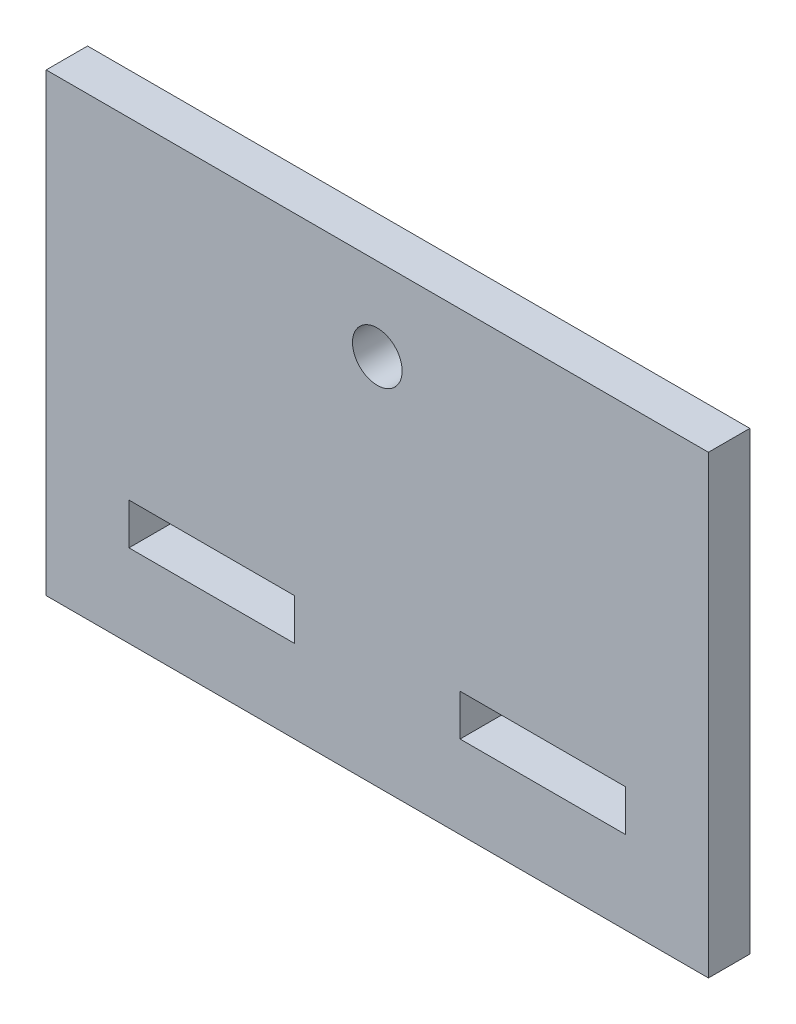
ISO-10303-21;
HEADER;
FILE_DESCRIPTION(('STEP AP214'),'2;1');
FILE_NAME('part.step','',(''),(''),'','','');
FILE_SCHEMA(('AUTOMOTIVE_DESIGN { 1 0 10303 214 1 1 1 1 }'));
ENDSEC;
DATA;
#1=APPLICATION_CONTEXT('core data for automotive mechanical design processes');
#2=APPLICATION_PROTOCOL_DEFINITION('international standard','automotive_design',2000,#1);
#3=PRODUCT_CONTEXT('',#1,'mechanical');
#4=PRODUCT('Part','Part','',(#3));
#5=PRODUCT_RELATED_PRODUCT_CATEGORY('part','',(#4));
#6=PRODUCT_DEFINITION_FORMATION('','',#4);
#7=PRODUCT_DEFINITION_CONTEXT('part definition',#1,'design');
#8=PRODUCT_DEFINITION('design','',#6,#7);
#9=PRODUCT_DEFINITION_SHAPE('','',#8);
#10=(LENGTH_UNIT() NAMED_UNIT(*) SI_UNIT(.MILLI.,.METRE.));
#11=(NAMED_UNIT(*) PLANE_ANGLE_UNIT() SI_UNIT($,.RADIAN.));
#12=(NAMED_UNIT(*) SI_UNIT($,.STERADIAN.) SOLID_ANGLE_UNIT());
#13=UNCERTAINTY_MEASURE_WITH_UNIT(LENGTH_MEASURE(1.E-05),#10,'distance_accuracy_value','');
#14=(GEOMETRIC_REPRESENTATION_CONTEXT(3) GLOBAL_UNCERTAINTY_ASSIGNED_CONTEXT((#13)) GLOBAL_UNIT_ASSIGNED_CONTEXT((#10,
#11,#12)) REPRESENTATION_CONTEXT('',''));
#15=CARTESIAN_POINT('',(0.,0.,0.));
#16=DIRECTION('',(0.,0.,1.));
#17=DIRECTION('',(1.,0.,0.));
#18=AXIS2_PLACEMENT_3D('',#15,#16,#17);
#19=CARTESIAN_POINT('',(0.,0.,3.175));
#20=DIRECTION('',(0.,0.,1.));
#21=DIRECTION('',(1.,0.,0.));
#22=AXIS2_PLACEMENT_3D('',#19,#20,#21);
#23=PLANE('',#22);
#24=DIRECTION('',(1.,0.,0.));
#25=VECTOR('',#24,1.);
#26=CARTESIAN_POINT('',(31.75,6.35,3.175));
#27=LINE('',#26,#25);
#28=CARTESIAN_POINT('',(31.75,6.35,3.175));
#29=VERTEX_POINT('',#28);
#30=CARTESIAN_POINT('',(44.45,6.35,3.175));
#31=VERTEX_POINT('',#30);
#32=EDGE_CURVE('E130',#29,#31,#27,.T.);
#33=ORIENTED_EDGE('',*,*,#32,.F.);
#34=DIRECTION('',(0.,-1.,0.));
#35=VECTOR('',#34,1.);
#36=CARTESIAN_POINT('',(31.75,6.35,3.175));
#37=LINE('',#36,#35);
#38=CARTESIAN_POINT('',(31.75,9.525,3.175));
#39=VERTEX_POINT('',#38);
#40=EDGE_CURVE('E122',#39,#29,#37,.T.);
#41=ORIENTED_EDGE('',*,*,#40,.F.);
#42=DIRECTION('',(-1.,0.,0.));
#43=VECTOR('',#42,1.);
#44=CARTESIAN_POINT('',(31.75,9.525,3.175));
#45=LINE('',#44,#43);
#46=CARTESIAN_POINT('',(44.45,9.525,3.175));
#47=VERTEX_POINT('',#46);
#48=EDGE_CURVE('E145',#47,#39,#45,.T.);
#49=ORIENTED_EDGE('',*,*,#48,.F.);
#50=DIRECTION('',(0.,1.,0.));
#51=VECTOR('',#50,1.);
#52=CARTESIAN_POINT('',(44.45,6.35,3.175));
#53=LINE('',#52,#51);
#54=EDGE_CURVE('E143',#31,#47,#53,.T.);
#55=ORIENTED_EDGE('',*,*,#54,.F.);
#56=EDGE_LOOP('',(#33,#41,#49,#55));
#57=FACE_BOUND('',#56,.T.);
#58=DIRECTION('',(1.,0.,0.));
#59=VECTOR('',#58,1.);
#60=CARTESIAN_POINT('',(6.35,6.35,3.175));
#61=LINE('',#60,#59);
#62=CARTESIAN_POINT('',(6.35,6.35,3.175));
#63=VERTEX_POINT('',#62);
#64=CARTESIAN_POINT('',(19.05,6.35,3.175));
#65=VERTEX_POINT('',#64);
#66=EDGE_CURVE('E163',#63,#65,#61,.T.);
#67=ORIENTED_EDGE('',*,*,#66,.F.);
#68=DIRECTION('',(0.,-1.,0.));
#69=VECTOR('',#68,1.);
#70=CARTESIAN_POINT('',(6.35,6.35,3.175));
#71=LINE('',#70,#69);
#72=CARTESIAN_POINT('',(6.35,9.525,3.175));
#73=VERTEX_POINT('',#72);
#74=EDGE_CURVE('E161',#73,#63,#71,.T.);
#75=ORIENTED_EDGE('',*,*,#74,.F.);
#76=DIRECTION('',(-1.,0.,0.));
#77=VECTOR('',#76,1.);
#78=CARTESIAN_POINT('',(6.35,9.525,3.175));
#79=LINE('',#78,#77);
#80=CARTESIAN_POINT('',(19.05,9.525,3.175));
#81=VERTEX_POINT('',#80);
#82=EDGE_CURVE('E169',#81,#73,#79,.T.);
#83=ORIENTED_EDGE('',*,*,#82,.F.);
#84=DIRECTION('',(0.,1.,0.));
#85=VECTOR('',#84,1.);
#86=CARTESIAN_POINT('',(19.05,6.35,3.175));
#87=LINE('',#86,#85);
#88=EDGE_CURVE('E166',#65,#81,#87,.T.);
#89=ORIENTED_EDGE('',*,*,#88,.F.);
#90=EDGE_LOOP('',(#67,#75,#83,#89));
#91=FACE_BOUND('',#90,.T.);
#92=DIRECTION('',(0.,-1.,0.));
#93=VECTOR('',#92,1.);
#94=CARTESIAN_POINT('',(0.,34.925,3.175));
#95=LINE('',#94,#93);
#96=CARTESIAN_POINT('',(0.,34.925,3.175));
#97=VERTEX_POINT('',#96);
#98=CARTESIAN_POINT('',(0.,0.,3.175));
#99=VERTEX_POINT('',#98);
#100=EDGE_CURVE('E192',#97,#99,#95,.T.);
#101=ORIENTED_EDGE('',*,*,#100,.T.);
#102=DIRECTION('',(1.,0.,0.));
#103=VECTOR('',#102,1.);
#104=CARTESIAN_POINT('',(0.,0.,3.175));
#105=LINE('',#104,#103);
#106=CARTESIAN_POINT('',(50.8,0.,3.175));
#107=VERTEX_POINT('',#106);
#108=EDGE_CURVE('E195',#99,#107,#105,.T.);
#109=ORIENTED_EDGE('',*,*,#108,.T.);
#110=DIRECTION('',(0.,1.,0.));
#111=VECTOR('',#110,1.);
#112=CARTESIAN_POINT('',(50.8,0.,3.175));
#113=LINE('',#112,#111);
#114=CARTESIAN_POINT('',(50.8,34.925,3.175));
#115=VERTEX_POINT('',#114);
#116=EDGE_CURVE('E198',#107,#115,#113,.T.);
#117=ORIENTED_EDGE('',*,*,#116,.T.);
#118=DIRECTION('',(-1.,0.,0.));
#119=VECTOR('',#118,1.);
#120=CARTESIAN_POINT('',(50.8,34.925,3.175));
#121=LINE('',#120,#119);
#122=EDGE_CURVE('E200',#115,#97,#121,.T.);
#123=ORIENTED_EDGE('',*,*,#122,.T.);
#124=EDGE_LOOP('',(#101,#109,#117,#123));
#125=FACE_BOUND('',#124,.T.);
#126=CARTESIAN_POINT('',(25.4,28.575,3.175));
#127=DIRECTION('',(0.,0.,1.));
#128=DIRECTION('',(1.,0.,0.));
#129=AXIS2_PLACEMENT_3D('',#126,#127,#128);
#130=CIRCLE('',#129,1.905);
#131=CARTESIAN_POINT('',(27.305,28.575,3.175));
#132=VERTEX_POINT('',#131);
#133=EDGE_CURVE('E151',#132,#132,#130,.T.);
#134=ORIENTED_EDGE('',*,*,#133,.F.);
#135=EDGE_LOOP('',(#134));
#136=FACE_BOUND('',#135,.T.);
#137=ADVANCED_FACE('F33',(#57,#91,#125,#136),#23,.T.);
#138=CARTESIAN_POINT('',(0.,0.,0.));
#139=DIRECTION('',(0.,0.,1.));
#140=DIRECTION('',(1.,0.,0.));
#141=AXIS2_PLACEMENT_3D('',#138,#139,#140);
#142=PLANE('',#141);
#143=DIRECTION('',(0.,-1.,0.));
#144=VECTOR('',#143,1.);
#145=CARTESIAN_POINT('',(6.35,6.35,0.));
#146=LINE('',#145,#144);
#147=CARTESIAN_POINT('',(6.35,9.525,0.));
#148=VERTEX_POINT('',#147);
#149=CARTESIAN_POINT('',(6.35,6.35,0.));
#150=VERTEX_POINT('',#149);
#151=EDGE_CURVE('E138',#148,#150,#146,.T.);
#152=ORIENTED_EDGE('',*,*,#151,.T.);
#153=DIRECTION('',(1.,0.,0.));
#154=VECTOR('',#153,1.);
#155=CARTESIAN_POINT('',(6.35,6.35,0.));
#156=LINE('',#155,#154);
#157=CARTESIAN_POINT('',(19.05,6.35,0.));
#158=VERTEX_POINT('',#157);
#159=EDGE_CURVE('E174',#150,#158,#156,.T.);
#160=ORIENTED_EDGE('',*,*,#159,.T.);
#161=DIRECTION('',(0.,1.,0.));
#162=VECTOR('',#161,1.);
#163=CARTESIAN_POINT('',(19.05,6.35,0.));
#164=LINE('',#163,#162);
#165=CARTESIAN_POINT('',(19.05,9.525,0.));
#166=VERTEX_POINT('',#165);
#167=EDGE_CURVE('E177',#158,#166,#164,.T.);
#168=ORIENTED_EDGE('',*,*,#167,.T.);
#169=DIRECTION('',(-1.,0.,0.));
#170=VECTOR('',#169,1.);
#171=CARTESIAN_POINT('',(6.35,9.525,0.));
#172=LINE('',#171,#170);
#173=EDGE_CURVE('E164',#166,#148,#172,.T.);
#174=ORIENTED_EDGE('',*,*,#173,.T.);
#175=EDGE_LOOP('',(#152,#160,#168,#174));
#176=FACE_BOUND('',#175,.T.);
#177=DIRECTION('',(0.,-1.,0.));
#178=VECTOR('',#177,1.);
#179=CARTESIAN_POINT('',(0.,34.925,0.));
#180=LINE('',#179,#178);
#181=CARTESIAN_POINT('',(0.,34.925,0.));
#182=VERTEX_POINT('',#181);
#183=CARTESIAN_POINT('',(0.,0.,0.));
#184=VERTEX_POINT('',#183);
#185=EDGE_CURVE('E191',#182,#184,#180,.T.);
#186=ORIENTED_EDGE('',*,*,#185,.F.);
#187=DIRECTION('',(-1.,0.,0.));
#188=VECTOR('',#187,1.);
#189=CARTESIAN_POINT('',(50.8,34.925,0.));
#190=LINE('',#189,#188);
#191=CARTESIAN_POINT('',(50.8,34.925,0.));
#192=VERTEX_POINT('',#191);
#193=EDGE_CURVE('E196',#192,#182,#190,.T.);
#194=ORIENTED_EDGE('',*,*,#193,.F.);
#195=DIRECTION('',(0.,1.,0.));
#196=VECTOR('',#195,1.);
#197=CARTESIAN_POINT('',(50.8,0.,0.));
#198=LINE('',#197,#196);
#199=CARTESIAN_POINT('',(50.8,0.,0.));
#200=VERTEX_POINT('',#199);
#201=EDGE_CURVE('E207',#200,#192,#198,.T.);
#202=ORIENTED_EDGE('',*,*,#201,.F.);
#203=DIRECTION('',(1.,0.,0.));
#204=VECTOR('',#203,1.);
#205=CARTESIAN_POINT('',(0.,0.,0.));
#206=LINE('',#205,#204);
#207=EDGE_CURVE('E205',#184,#200,#206,.T.);
#208=ORIENTED_EDGE('',*,*,#207,.F.);
#209=EDGE_LOOP('',(#186,#194,#202,#208));
#210=FACE_BOUND('',#209,.T.);
#211=DIRECTION('',(0.,-1.,0.));
#212=VECTOR('',#211,1.);
#213=CARTESIAN_POINT('',(31.75,6.35,0.));
#214=LINE('',#213,#212);
#215=CARTESIAN_POINT('',(31.75,9.525,0.));
#216=VERTEX_POINT('',#215);
#217=CARTESIAN_POINT('',(31.75,6.35,0.));
#218=VERTEX_POINT('',#217);
#219=EDGE_CURVE('E56',#216,#218,#214,.T.);
#220=ORIENTED_EDGE('',*,*,#219,.T.);
#221=DIRECTION('',(1.,0.,0.));
#222=VECTOR('',#221,1.);
#223=CARTESIAN_POINT('',(31.75,6.35,0.));
#224=LINE('',#223,#222);
#225=CARTESIAN_POINT('',(44.45,6.35,0.));
#226=VERTEX_POINT('',#225);
#227=EDGE_CURVE('E137',#218,#226,#224,.T.);
#228=ORIENTED_EDGE('',*,*,#227,.T.);
#229=DIRECTION('',(0.,1.,0.));
#230=VECTOR('',#229,1.);
#231=CARTESIAN_POINT('',(44.45,6.35,0.));
#232=LINE('',#231,#230);
#233=CARTESIAN_POINT('',(44.45,9.525,0.));
#234=VERTEX_POINT('',#233);
#235=EDGE_CURVE('E153',#226,#234,#232,.T.);
#236=ORIENTED_EDGE('',*,*,#235,.T.);
#237=DIRECTION('',(-1.,0.,0.));
#238=VECTOR('',#237,1.);
#239=CARTESIAN_POINT('',(31.75,9.525,0.));
#240=LINE('',#239,#238);
#241=EDGE_CURVE('E131',#234,#216,#240,.T.);
#242=ORIENTED_EDGE('',*,*,#241,.T.);
#243=EDGE_LOOP('',(#220,#228,#236,#242));
#244=FACE_BOUND('',#243,.T.);
#245=CARTESIAN_POINT('',(25.4,28.575,0.));
#246=DIRECTION('',(0.,0.,1.));
#247=DIRECTION('',(1.,0.,0.));
#248=AXIS2_PLACEMENT_3D('',#245,#246,#247);
#249=CIRCLE('',#248,1.905);
#250=CARTESIAN_POINT('',(27.305,28.575,0.));
#251=VERTEX_POINT('',#250);
#252=EDGE_CURVE('E305',#251,#251,#249,.T.);
#253=ORIENTED_EDGE('',*,*,#252,.T.);
#254=EDGE_LOOP('',(#253));
#255=FACE_BOUND('',#254,.T.);
#256=ADVANCED_FACE('F225',(#176,#210,#244,#255),#142,.F.);
#257=CARTESIAN_POINT('',(0.,34.925,3.175));
#258=DIRECTION('',(1.,0.,0.));
#259=DIRECTION('',(0.,1.,0.));
#260=AXIS2_PLACEMENT_3D('',#257,#258,#259);
#261=PLANE('',#260);
#262=ORIENTED_EDGE('',*,*,#185,.T.);
#263=DIRECTION('',(0.,0.,-1.));
#264=VECTOR('',#263,1.);
#265=CARTESIAN_POINT('',(0.,0.,3.175));
#266=LINE('',#265,#264);
#267=EDGE_CURVE('E11',#99,#184,#266,.T.);
#268=ORIENTED_EDGE('',*,*,#267,.F.);
#269=ORIENTED_EDGE('',*,*,#100,.F.);
#270=DIRECTION('',(0.,0.,-1.));
#271=VECTOR('',#270,1.);
#272=CARTESIAN_POINT('',(0.,34.925,3.175));
#273=LINE('',#272,#271);
#274=EDGE_CURVE('E202',#97,#182,#273,.T.);
#275=ORIENTED_EDGE('',*,*,#274,.T.);
#276=EDGE_LOOP('',(#262,#268,#269,#275));
#277=FACE_BOUND('',#276,.T.);
#278=ADVANCED_FACE('F35',(#277),#261,.F.);
#279=CARTESIAN_POINT('',(0.,0.,3.175));
#280=DIRECTION('',(0.,1.,0.));
#281=DIRECTION('',(0.,0.,1.));
#282=AXIS2_PLACEMENT_3D('',#279,#280,#281);
#283=PLANE('',#282);
#284=ORIENTED_EDGE('',*,*,#207,.T.);
#285=DIRECTION('',(0.,0.,-1.));
#286=VECTOR('',#285,1.);
#287=CARTESIAN_POINT('',(50.8,0.,3.175));
#288=LINE('',#287,#286);
#289=EDGE_CURVE('E41',#107,#200,#288,.T.);
#290=ORIENTED_EDGE('',*,*,#289,.F.);
#291=ORIENTED_EDGE('',*,*,#108,.F.);
#292=ORIENTED_EDGE('',*,*,#267,.T.);
#293=EDGE_LOOP('',(#284,#290,#291,#292));
#294=FACE_BOUND('',#293,.T.);
#295=ADVANCED_FACE('F236',(#294),#283,.F.);
#296=CARTESIAN_POINT('',(50.8,0.,3.175));
#297=DIRECTION('',(-1.,0.,0.));
#298=DIRECTION('',(0.,-1.,0.));
#299=AXIS2_PLACEMENT_3D('',#296,#297,#298);
#300=PLANE('',#299);
#301=ORIENTED_EDGE('',*,*,#201,.T.);
#302=DIRECTION('',(0.,0.,-1.));
#303=VECTOR('',#302,1.);
#304=CARTESIAN_POINT('',(50.8,34.925,3.175));
#305=LINE('',#304,#303);
#306=EDGE_CURVE('E212',#115,#192,#305,.T.);
#307=ORIENTED_EDGE('',*,*,#306,.F.);
#308=ORIENTED_EDGE('',*,*,#116,.F.);
#309=ORIENTED_EDGE('',*,*,#289,.T.);
#310=EDGE_LOOP('',(#301,#307,#308,#309));
#311=FACE_BOUND('',#310,.T.);
#312=ADVANCED_FACE('F219',(#311),#300,.F.);
#313=CARTESIAN_POINT('',(50.8,34.925,3.175));
#314=DIRECTION('',(0.,-1.,0.));
#315=DIRECTION('',(1.,0.,0.));
#316=AXIS2_PLACEMENT_3D('',#313,#314,#315);
#317=PLANE('',#316);
#318=ORIENTED_EDGE('',*,*,#193,.T.);
#319=ORIENTED_EDGE('',*,*,#274,.F.);
#320=ORIENTED_EDGE('',*,*,#122,.F.);
#321=ORIENTED_EDGE('',*,*,#306,.T.);
#322=EDGE_LOOP('',(#318,#319,#320,#321));
#323=FACE_BOUND('',#322,.T.);
#324=ADVANCED_FACE('F229',(#323),#317,.F.);
#325=CARTESIAN_POINT('',(6.35,6.35,3.175));
#326=DIRECTION('',(1.,0.,0.));
#327=DIRECTION('',(0.,0.,-1.));
#328=AXIS2_PLACEMENT_3D('',#325,#326,#327);
#329=PLANE('',#328);
#330=ORIENTED_EDGE('',*,*,#151,.F.);
#331=DIRECTION('',(0.,0.,-1.));
#332=VECTOR('',#331,1.);
#333=CARTESIAN_POINT('',(6.35,9.525,3.175));
#334=LINE('',#333,#332);
#335=EDGE_CURVE('E171',#73,#148,#334,.T.);
#336=ORIENTED_EDGE('',*,*,#335,.F.);
#337=ORIENTED_EDGE('',*,*,#74,.T.);
#338=DIRECTION('',(0.,0.,-1.));
#339=VECTOR('',#338,1.);
#340=CARTESIAN_POINT('',(6.35,6.35,3.175));
#341=LINE('',#340,#339);
#342=EDGE_CURVE('E188',#63,#150,#341,.T.);
#343=ORIENTED_EDGE('',*,*,#342,.T.);
#344=EDGE_LOOP('',(#330,#336,#337,#343));
#345=FACE_BOUND('',#344,.T.);
#346=ADVANCED_FACE('F251',(#345),#329,.T.);
#347=CARTESIAN_POINT('',(6.35,6.35,3.175));
#348=DIRECTION('',(0.,1.,0.));
#349=DIRECTION('',(-1.,0.,0.));
#350=AXIS2_PLACEMENT_3D('',#347,#348,#349);
#351=PLANE('',#350);
#352=ORIENTED_EDGE('',*,*,#159,.F.);
#353=ORIENTED_EDGE('',*,*,#342,.F.);
#354=ORIENTED_EDGE('',*,*,#66,.T.);
#355=DIRECTION('',(0.,0.,-1.));
#356=VECTOR('',#355,1.);
#357=CARTESIAN_POINT('',(19.05,6.35,3.175));
#358=LINE('',#357,#356);
#359=EDGE_CURVE('E186',#65,#158,#358,.T.);
#360=ORIENTED_EDGE('',*,*,#359,.T.);
#361=EDGE_LOOP('',(#352,#353,#354,#360));
#362=FACE_BOUND('',#361,.T.);
#363=ADVANCED_FACE('F258',(#362),#351,.T.);
#364=CARTESIAN_POINT('',(19.05,6.35,3.175));
#365=DIRECTION('',(-1.,0.,0.));
#366=DIRECTION('',(0.,0.,1.));
#367=AXIS2_PLACEMENT_3D('',#364,#365,#366);
#368=PLANE('',#367);
#369=ORIENTED_EDGE('',*,*,#167,.F.);
#370=ORIENTED_EDGE('',*,*,#359,.F.);
#371=ORIENTED_EDGE('',*,*,#88,.T.);
#372=DIRECTION('',(0.,0.,-1.));
#373=VECTOR('',#372,1.);
#374=CARTESIAN_POINT('',(19.05,9.525,3.175));
#375=LINE('',#374,#373);
#376=EDGE_CURVE('E184',#81,#166,#375,.T.);
#377=ORIENTED_EDGE('',*,*,#376,.T.);
#378=EDGE_LOOP('',(#369,#370,#371,#377));
#379=FACE_BOUND('',#378,.T.);
#380=ADVANCED_FACE('F263',(#379),#368,.T.);
#381=CARTESIAN_POINT('',(6.35,9.525,3.175));
#382=DIRECTION('',(0.,-1.,0.));
#383=DIRECTION('',(1.,0.,0.));
#384=AXIS2_PLACEMENT_3D('',#381,#382,#383);
#385=PLANE('',#384);
#386=ORIENTED_EDGE('',*,*,#173,.F.);
#387=ORIENTED_EDGE('',*,*,#376,.F.);
#388=ORIENTED_EDGE('',*,*,#82,.T.);
#389=ORIENTED_EDGE('',*,*,#335,.T.);
#390=EDGE_LOOP('',(#386,#387,#388,#389));
#391=FACE_BOUND('',#390,.T.);
#392=ADVANCED_FACE('F270',(#391),#385,.T.);
#393=CARTESIAN_POINT('',(31.75,6.35,3.175));
#394=DIRECTION('',(1.,0.,0.));
#395=DIRECTION('',(0.,0.,-1.));
#396=AXIS2_PLACEMENT_3D('',#393,#394,#395);
#397=PLANE('',#396);
#398=ORIENTED_EDGE('',*,*,#219,.F.);
#399=DIRECTION('',(0.,0.,-1.));
#400=VECTOR('',#399,1.);
#401=CARTESIAN_POINT('',(31.75,9.525,3.175));
#402=LINE('',#401,#400);
#403=EDGE_CURVE('E126',#39,#216,#402,.T.);
#404=ORIENTED_EDGE('',*,*,#403,.F.);
#405=ORIENTED_EDGE('',*,*,#40,.T.);
#406=DIRECTION('',(0.,0.,-1.));
#407=VECTOR('',#406,1.);
#408=CARTESIAN_POINT('',(31.75,6.35,3.175));
#409=LINE('',#408,#407);
#410=EDGE_CURVE('E125',#29,#218,#409,.T.);
#411=ORIENTED_EDGE('',*,*,#410,.T.);
#412=EDGE_LOOP('',(#398,#404,#405,#411));
#413=FACE_BOUND('',#412,.T.);
#414=ADVANCED_FACE('F124',(#413),#397,.T.);
#415=CARTESIAN_POINT('',(31.75,6.35,3.175));
#416=DIRECTION('',(0.,1.,0.));
#417=DIRECTION('',(0.,0.,1.));
#418=AXIS2_PLACEMENT_3D('',#415,#416,#417);
#419=PLANE('',#418);
#420=ORIENTED_EDGE('',*,*,#227,.F.);
#421=ORIENTED_EDGE('',*,*,#410,.F.);
#422=ORIENTED_EDGE('',*,*,#32,.T.);
#423=DIRECTION('',(0.,0.,-1.));
#424=VECTOR('',#423,1.);
#425=CARTESIAN_POINT('',(44.45,6.35,3.175));
#426=LINE('',#425,#424);
#427=EDGE_CURVE('E139',#31,#226,#426,.T.);
#428=ORIENTED_EDGE('',*,*,#427,.T.);
#429=EDGE_LOOP('',(#420,#421,#422,#428));
#430=FACE_BOUND('',#429,.T.);
#431=ADVANCED_FACE('F134',(#430),#419,.T.);
#432=CARTESIAN_POINT('',(44.45,6.35,3.175));
#433=DIRECTION('',(-1.,0.,0.));
#434=DIRECTION('',(0.,-1.,0.));
#435=AXIS2_PLACEMENT_3D('',#432,#433,#434);
#436=PLANE('',#435);
#437=ORIENTED_EDGE('',*,*,#235,.F.);
#438=ORIENTED_EDGE('',*,*,#427,.F.);
#439=ORIENTED_EDGE('',*,*,#54,.T.);
#440=DIRECTION('',(0.,0.,-1.));
#441=VECTOR('',#440,1.);
#442=CARTESIAN_POINT('',(44.45,9.525,3.175));
#443=LINE('',#442,#441);
#444=EDGE_CURVE('E48',#47,#234,#443,.T.);
#445=ORIENTED_EDGE('',*,*,#444,.T.);
#446=EDGE_LOOP('',(#437,#438,#439,#445));
#447=FACE_BOUND('',#446,.T.);
#448=ADVANCED_FACE('F288',(#447),#436,.T.);
#449=CARTESIAN_POINT('',(31.75,9.525,3.175));
#450=DIRECTION('',(0.,-1.,0.));
#451=DIRECTION('',(1.,0.,0.));
#452=AXIS2_PLACEMENT_3D('',#449,#450,#451);
#453=PLANE('',#452);
#454=ORIENTED_EDGE('',*,*,#241,.F.);
#455=ORIENTED_EDGE('',*,*,#444,.F.);
#456=ORIENTED_EDGE('',*,*,#48,.T.);
#457=ORIENTED_EDGE('',*,*,#403,.T.);
#458=EDGE_LOOP('',(#454,#455,#456,#457));
#459=FACE_BOUND('',#458,.T.);
#460=ADVANCED_FACE('F291',(#459),#453,.T.);
#461=CARTESIAN_POINT('',(25.4,28.575,3.175));
#462=DIRECTION('',(0.,0.,-1.));
#463=DIRECTION('',(-1.,0.,0.));
#464=AXIS2_PLACEMENT_3D('',#461,#462,#463);
#465=CYLINDRICAL_SURFACE('',#464,1.905);
#466=ORIENTED_EDGE('',*,*,#133,.T.);
#467=EDGE_LOOP('',(#466));
#468=FACE_BOUND('',#467,.T.);
#469=ORIENTED_EDGE('',*,*,#252,.F.);
#470=EDGE_LOOP('',(#469));
#471=FACE_BOUND('',#470,.T.);
#472=ADVANCED_FACE('F295',(#468,#471),#465,.F.);
#473=CLOSED_SHELL('',(#137,#256,#278,#295,#312,#324,#346,#363,#380,#392,#414,#431,#448,#460,#472));
#474=MANIFOLD_SOLID_BREP('B2',#473);
#475=ADVANCED_BREP_SHAPE_REPRESENTATION('',(#18,#474),#14);
#476=SHAPE_DEFINITION_REPRESENTATION(#9,#475);
ENDSEC;
END-ISO-10303-21;
